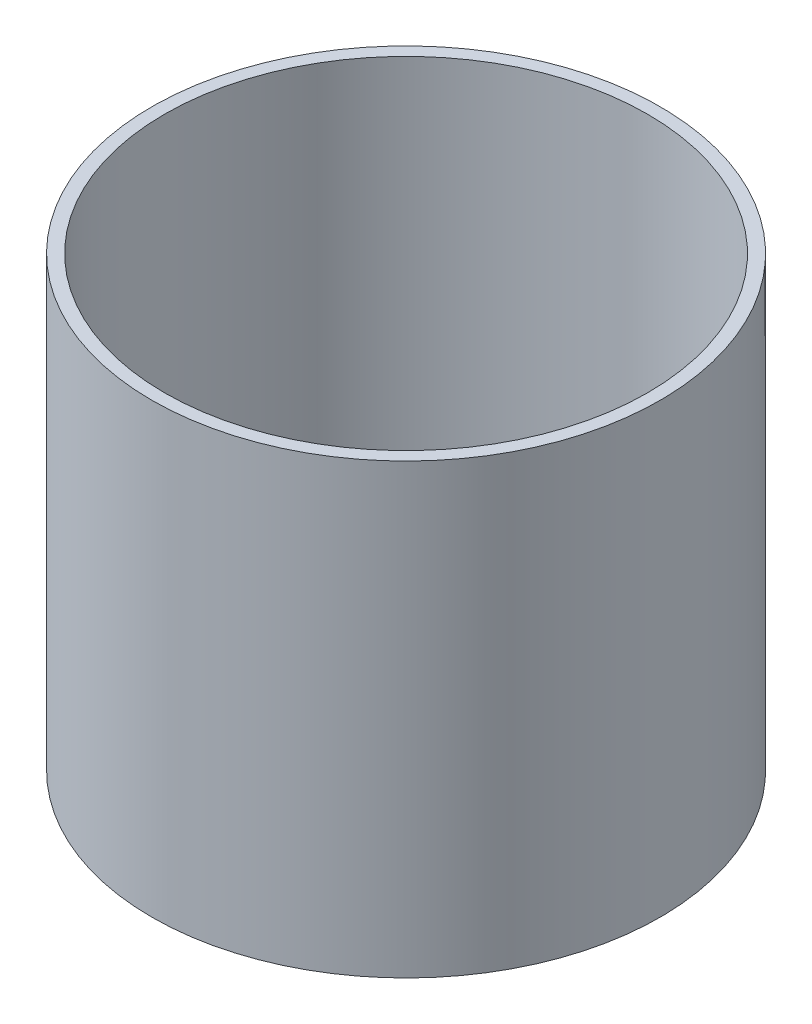
ISO-10303-21;
HEADER;
FILE_DESCRIPTION(('STEP AP214'),'2;1');
FILE_NAME('part.step','',(''),(''),'','','');
FILE_SCHEMA(('AUTOMOTIVE_DESIGN { 1 0 10303 214 1 1 1 1 }'));
ENDSEC;
DATA;
#1=APPLICATION_CONTEXT('core data for automotive mechanical design processes');
#2=APPLICATION_PROTOCOL_DEFINITION('international standard','automotive_design',2000,#1);
#3=PRODUCT_CONTEXT('',#1,'mechanical');
#4=PRODUCT('Part','Part','',(#3));
#5=PRODUCT_RELATED_PRODUCT_CATEGORY('part','',(#4));
#6=PRODUCT_DEFINITION_FORMATION('','',#4);
#7=PRODUCT_DEFINITION_CONTEXT('part definition',#1,'design');
#8=PRODUCT_DEFINITION('design','',#6,#7);
#9=PRODUCT_DEFINITION_SHAPE('','',#8);
#10=(LENGTH_UNIT() NAMED_UNIT(*) SI_UNIT(.MILLI.,.METRE.));
#11=(NAMED_UNIT(*) PLANE_ANGLE_UNIT() SI_UNIT($,.RADIAN.));
#12=(NAMED_UNIT(*) SI_UNIT($,.STERADIAN.) SOLID_ANGLE_UNIT());
#13=UNCERTAINTY_MEASURE_WITH_UNIT(LENGTH_MEASURE(1.E-05),#10,'distance_accuracy_value','');
#14=(GEOMETRIC_REPRESENTATION_CONTEXT(3) GLOBAL_UNCERTAINTY_ASSIGNED_CONTEXT((#13)) GLOBAL_UNIT_ASSIGNED_CONTEXT((#10,
#11,#12)) REPRESENTATION_CONTEXT('',''));
#15=CARTESIAN_POINT('',(0.,0.,0.));
#16=DIRECTION('',(0.,0.,1.));
#17=DIRECTION('',(1.,0.,0.));
#18=AXIS2_PLACEMENT_3D('',#15,#16,#17);
#19=CARTESIAN_POINT('',(0.,70.,0.));
#20=DIRECTION('',(0.,1.,0.));
#21=DIRECTION('',(0.,0.,1.));
#22=AXIS2_PLACEMENT_3D('',#19,#20,#21);
#23=PLANE('',#22);
#24=CARTESIAN_POINT('',(0.,70.,0.));
#25=DIRECTION('',(0.,1.,0.));
#26=DIRECTION('',(0.,0.,1.));
#27=AXIS2_PLACEMENT_3D('',#24,#25,#26);
#28=CIRCLE('',#27,39.75);
#29=CARTESIAN_POINT('',(0.,70.,39.75));
#30=VERTEX_POINT('',#29);
#31=EDGE_CURVE('E10',#30,#30,#28,.T.);
#32=ORIENTED_EDGE('',*,*,#31,.T.);
#33=EDGE_LOOP('',(#32));
#34=FACE_BOUND('',#33,.T.);
#35=CARTESIAN_POINT('',(0.,70.,0.));
#36=DIRECTION('',(0.,1.,0.));
#37=DIRECTION('',(0.,0.,1.));
#38=AXIS2_PLACEMENT_3D('',#35,#36,#37);
#39=CIRCLE('',#38,37.75);
#40=CARTESIAN_POINT('',(0.,70.,37.75));
#41=VERTEX_POINT('',#40);
#42=EDGE_CURVE('E43',#41,#41,#39,.T.);
#43=ORIENTED_EDGE('',*,*,#42,.F.);
#44=EDGE_LOOP('',(#43));
#45=FACE_BOUND('',#44,.T.);
#46=ADVANCED_FACE('F32',(#34,#45),#23,.T.);
#47=CARTESIAN_POINT('',(0.,0.,0.));
#48=DIRECTION('',(0.,1.,0.));
#49=DIRECTION('',(0.,0.,1.));
#50=AXIS2_PLACEMENT_3D('',#47,#48,#49);
#51=PLANE('',#50);
#52=CARTESIAN_POINT('',(0.,0.,0.));
#53=DIRECTION('',(0.,1.,0.));
#54=DIRECTION('',(0.,0.,1.));
#55=AXIS2_PLACEMENT_3D('',#52,#53,#54);
#56=CIRCLE('',#55,39.75);
#57=CARTESIAN_POINT('',(0.,0.,39.75));
#58=VERTEX_POINT('',#57);
#59=EDGE_CURVE('E36',#58,#58,#56,.T.);
#60=ORIENTED_EDGE('',*,*,#59,.F.);
#61=EDGE_LOOP('',(#60));
#62=FACE_BOUND('',#61,.T.);
#63=CARTESIAN_POINT('',(0.,0.,0.));
#64=DIRECTION('',(0.,1.,0.));
#65=DIRECTION('',(0.,0.,1.));
#66=AXIS2_PLACEMENT_3D('',#63,#64,#65);
#67=CIRCLE('',#66,37.75);
#68=CARTESIAN_POINT('',(0.,0.,37.75));
#69=VERTEX_POINT('',#68);
#70=EDGE_CURVE('E45',#69,#69,#67,.T.);
#71=ORIENTED_EDGE('',*,*,#70,.T.);
#72=EDGE_LOOP('',(#71));
#73=FACE_BOUND('',#72,.T.);
#74=ADVANCED_FACE('F55',(#62,#73),#51,.F.);
#75=CARTESIAN_POINT('',(0.,70.,0.));
#76=DIRECTION('',(0.,-1.,0.));
#77=DIRECTION('',(0.,0.,-1.));
#78=AXIS2_PLACEMENT_3D('',#75,#76,#77);
#79=CYLINDRICAL_SURFACE('',#78,39.75);
#80=ORIENTED_EDGE('',*,*,#31,.F.);
#81=EDGE_LOOP('',(#80));
#82=FACE_BOUND('',#81,.T.);
#83=ORIENTED_EDGE('',*,*,#59,.T.);
#84=EDGE_LOOP('',(#83));
#85=FACE_BOUND('',#84,.T.);
#86=ADVANCED_FACE('F34',(#82,#85),#79,.T.);
#87=CARTESIAN_POINT('',(0.,70.,0.));
#88=DIRECTION('',(0.,-1.,0.));
#89=DIRECTION('',(0.,0.,-1.));
#90=AXIS2_PLACEMENT_3D('',#87,#88,#89);
#91=CYLINDRICAL_SURFACE('',#90,37.75);
#92=ORIENTED_EDGE('',*,*,#42,.T.);
#93=EDGE_LOOP('',(#92));
#94=FACE_BOUND('',#93,.T.);
#95=ORIENTED_EDGE('',*,*,#70,.F.);
#96=EDGE_LOOP('',(#95));
#97=FACE_BOUND('',#96,.T.);
#98=ADVANCED_FACE('F51',(#94,#97),#91,.F.);
#99=CLOSED_SHELL('',(#46,#74,#86,#98));
#100=MANIFOLD_SOLID_BREP('B2',#99);
#101=ADVANCED_BREP_SHAPE_REPRESENTATION('',(#18,#100),#14);
#102=SHAPE_DEFINITION_REPRESENTATION(#9,#101);
ENDSEC;
END-ISO-10303-21;
